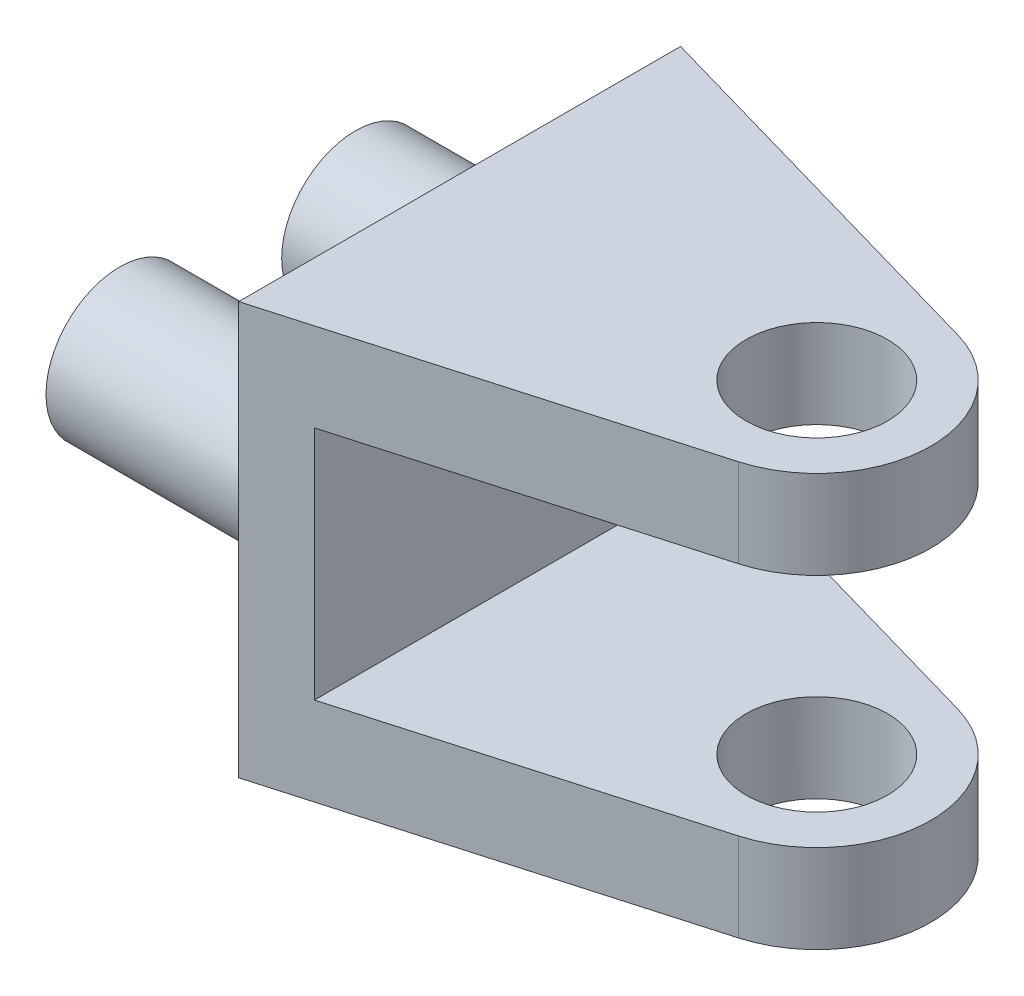
ISO-10303-21;
HEADER;
FILE_DESCRIPTION(('STEP AP214'),'2;1');
FILE_NAME('part.step','',(''),(''),'','','');
FILE_SCHEMA(('AUTOMOTIVE_DESIGN { 1 0 10303 214 1 1 1 1 }'));
ENDSEC;
DATA;
#1=APPLICATION_CONTEXT('core data for automotive mechanical design processes');
#2=APPLICATION_PROTOCOL_DEFINITION('international standard','automotive_design',2000,#1);
#3=PRODUCT_CONTEXT('',#1,'mechanical');
#4=PRODUCT('Part','Part','',(#3));
#5=PRODUCT_RELATED_PRODUCT_CATEGORY('part','',(#4));
#6=PRODUCT_DEFINITION_FORMATION('','',#4);
#7=PRODUCT_DEFINITION_CONTEXT('part definition',#1,'design');
#8=PRODUCT_DEFINITION('design','',#6,#7);
#9=PRODUCT_DEFINITION_SHAPE('','',#8);
#10=(LENGTH_UNIT() NAMED_UNIT(*) SI_UNIT(.MILLI.,.METRE.));
#11=(NAMED_UNIT(*) PLANE_ANGLE_UNIT() SI_UNIT($,.RADIAN.));
#12=(NAMED_UNIT(*) SI_UNIT($,.STERADIAN.) SOLID_ANGLE_UNIT());
#13=UNCERTAINTY_MEASURE_WITH_UNIT(LENGTH_MEASURE(1.E-05),#10,'distance_accuracy_value','');
#14=(GEOMETRIC_REPRESENTATION_CONTEXT(3) GLOBAL_UNCERTAINTY_ASSIGNED_CONTEXT((#13)) GLOBAL_UNIT_ASSIGNED_CONTEXT((#10,
#11,#12)) REPRESENTATION_CONTEXT('',''));
#15=CARTESIAN_POINT('',(0.,0.,0.));
#16=DIRECTION('',(0.,0.,1.));
#17=DIRECTION('',(1.,0.,0.));
#18=AXIS2_PLACEMENT_3D('',#15,#16,#17);
#19=CARTESIAN_POINT('',(0.,14.,0.));
#20=DIRECTION('',(0.,-1.,0.));
#21=DIRECTION('',(0.,0.,-1.));
#22=AXIS2_PLACEMENT_3D('',#19,#20,#21);
#23=CYLINDRICAL_SURFACE('',#22,3.875);
#24=DIRECTION('',(0.,-1.,0.));
#25=VECTOR('',#24,1.);
#26=CARTESIAN_POINT('',(1.06602054618055,14.,3.72548321632522));
#27=LINE('',#26,#25);
#28=CARTESIAN_POINT('',(1.06602054618055,14.,3.72548321632522));
#29=VERTEX_POINT('',#28);
#30=CARTESIAN_POINT('',(1.06602054618055,11.,3.72548321632522));
#31=VERTEX_POINT('',#30);
#32=EDGE_CURVE('E132',#29,#31,#27,.T.);
#33=ORIENTED_EDGE('',*,*,#32,.T.);
#34=CARTESIAN_POINT('',(0.,11.,0.));
#35=DIRECTION('',(0.,1.,0.));
#36=DIRECTION('',(0.,0.,1.));
#37=AXIS2_PLACEMENT_3D('',#34,#35,#36);
#38=CIRCLE('',#37,3.875);
#39=CARTESIAN_POINT('',(1.06602054618055,11.,-3.72548321632523));
#40=VERTEX_POINT('',#39);
#41=EDGE_CURVE('E176',#31,#40,#38,.T.);
#42=ORIENTED_EDGE('',*,*,#41,.T.);
#43=DIRECTION('',(0.,-1.,0.));
#44=VECTOR('',#43,1.);
#45=CARTESIAN_POINT('',(1.06602054618055,14.,-3.72548321632523));
#46=LINE('',#45,#44);
#47=CARTESIAN_POINT('',(1.06602054618055,14.,-3.72548321632523));
#48=VERTEX_POINT('',#47);
#49=EDGE_CURVE('E144',#48,#40,#46,.T.);
#50=ORIENTED_EDGE('',*,*,#49,.F.);
#51=CARTESIAN_POINT('',(0.,14.,0.));
#52=DIRECTION('',(0.,1.,0.));
#53=DIRECTION('',(0.,0.,1.));
#54=AXIS2_PLACEMENT_3D('',#51,#52,#53);
#55=CIRCLE('',#54,3.875);
#56=EDGE_CURVE('E88',#29,#48,#55,.T.);
#57=ORIENTED_EDGE('',*,*,#56,.F.);
#58=EDGE_LOOP('',(#33,#42,#50,#57));
#59=FACE_BOUND('',#58,.T.);
#60=ADVANCED_FACE('F35',(#59),#23,.T.);
#61=CARTESIAN_POINT('',(0.,14.,0.));
#62=DIRECTION('',(0.,-1.,0.));
#63=DIRECTION('',(0.,0.,-1.));
#64=AXIS2_PLACEMENT_3D('',#61,#62,#63);
#65=CYLINDRICAL_SURFACE('',#64,2.4);
#66=CARTESIAN_POINT('',(0.,11.,0.));
#67=DIRECTION('',(0.,1.,0.));
#68=DIRECTION('',(0.,0.,1.));
#69=AXIS2_PLACEMENT_3D('',#66,#67,#68);
#70=CIRCLE('',#69,2.4);
#71=CARTESIAN_POINT('',(0.,11.,2.4));
#72=VERTEX_POINT('',#71);
#73=EDGE_CURVE('E138',#72,#72,#70,.T.);
#74=ORIENTED_EDGE('',*,*,#73,.F.);
#75=EDGE_LOOP('',(#74));
#76=FACE_BOUND('',#75,.T.);
#77=CARTESIAN_POINT('',(0.,14.,0.));
#78=DIRECTION('',(0.,1.,0.));
#79=DIRECTION('',(0.,0.,1.));
#80=AXIS2_PLACEMENT_3D('',#77,#78,#79);
#81=CIRCLE('',#80,2.4);
#82=CARTESIAN_POINT('',(0.,14.,2.4));
#83=VERTEX_POINT('',#82);
#84=EDGE_CURVE('E161',#83,#83,#81,.T.);
#85=ORIENTED_EDGE('',*,*,#84,.T.);
#86=EDGE_LOOP('',(#85));
#87=FACE_BOUND('',#86,.T.);
#88=ADVANCED_FACE('F223',(#76,#87),#65,.F.);
#89=CARTESIAN_POINT('',(0.,14.,0.));
#90=DIRECTION('',(0.,1.,0.));
#91=DIRECTION('',(0.,0.,1.));
#92=AXIS2_PLACEMENT_3D('',#89,#90,#91);
#93=PLANE('',#92);
#94=DIRECTION('',(0.961415023567799,0.,-0.27510207643369));
#95=VECTOR('',#94,1.);
#96=CARTESIAN_POINT('',(-12.125,14.,7.5));
#97=LINE('',#96,#95);
#98=CARTESIAN_POINT('',(-12.125,14.,7.5));
#99=VERTEX_POINT('',#98);
#100=EDGE_CURVE('E152',#99,#29,#97,.T.);
#101=ORIENTED_EDGE('',*,*,#100,.T.);
#102=ORIENTED_EDGE('',*,*,#56,.T.);
#103=DIRECTION('',(-0.9614150235678,0.,-0.27510207643369));
#104=VECTOR('',#103,1.);
#105=CARTESIAN_POINT('',(-12.125,14.,-7.5));
#106=LINE('',#105,#104);
#107=CARTESIAN_POINT('',(-12.125,14.,-7.5));
#108=VERTEX_POINT('',#107);
#109=EDGE_CURVE('E163',#48,#108,#106,.T.);
#110=ORIENTED_EDGE('',*,*,#109,.T.);
#111=DIRECTION('',(0.,0.,1.));
#112=VECTOR('',#111,1.);
#113=CARTESIAN_POINT('',(-12.125,14.,-7.5));
#114=LINE('',#113,#112);
#115=EDGE_CURVE('E59',#108,#99,#114,.T.);
#116=ORIENTED_EDGE('',*,*,#115,.T.);
#117=EDGE_LOOP('',(#101,#102,#110,#116));
#118=FACE_BOUND('',#117,.T.);
#119=ORIENTED_EDGE('',*,*,#84,.F.);
#120=EDGE_LOOP('',(#119));
#121=FACE_BOUND('',#120,.T.);
#122=ADVANCED_FACE('F228',(#118,#121),#93,.T.);
#123=CARTESIAN_POINT('',(0.,0.,0.));
#124=DIRECTION('',(0.,1.,0.));
#125=DIRECTION('',(0.,0.,1.));
#126=AXIS2_PLACEMENT_3D('',#123,#124,#125);
#127=PLANE('',#126);
#128=DIRECTION('',(0.961415023567799,0.,-0.27510207643369));
#129=VECTOR('',#128,1.);
#130=CARTESIAN_POINT('',(-12.125,0.,7.5));
#131=LINE('',#130,#129);
#132=CARTESIAN_POINT('',(-12.125,0.,7.5));
#133=VERTEX_POINT('',#132);
#134=CARTESIAN_POINT('',(1.06602054618055,0.,3.72548321632522));
#135=VERTEX_POINT('',#134);
#136=EDGE_CURVE('E158',#133,#135,#131,.T.);
#137=ORIENTED_EDGE('',*,*,#136,.F.);
#138=DIRECTION('',(0.,0.,1.));
#139=VECTOR('',#138,1.);
#140=CARTESIAN_POINT('',(-12.125,0.,-7.5));
#141=LINE('',#140,#139);
#142=CARTESIAN_POINT('',(-12.125,0.,-7.5));
#143=VERTEX_POINT('',#142);
#144=EDGE_CURVE('E80',#143,#133,#141,.T.);
#145=ORIENTED_EDGE('',*,*,#144,.F.);
#146=DIRECTION('',(-0.9614150235678,0.,-0.27510207643369));
#147=VECTOR('',#146,1.);
#148=CARTESIAN_POINT('',(-12.125,0.,-7.5));
#149=LINE('',#148,#147);
#150=CARTESIAN_POINT('',(1.06602054618055,0.,-3.72548321632523));
#151=VERTEX_POINT('',#150);
#152=EDGE_CURVE('E153',#151,#143,#149,.T.);
#153=ORIENTED_EDGE('',*,*,#152,.F.);
#154=CARTESIAN_POINT('',(0.,0.,0.));
#155=DIRECTION('',(0.,1.,0.));
#156=DIRECTION('',(0.,0.,1.));
#157=AXIS2_PLACEMENT_3D('',#154,#155,#156);
#158=CIRCLE('',#157,3.875);
#159=EDGE_CURVE('E155',#135,#151,#158,.T.);
#160=ORIENTED_EDGE('',*,*,#159,.F.);
#161=EDGE_LOOP('',(#137,#145,#153,#160));
#162=FACE_BOUND('',#161,.T.);
#163=CARTESIAN_POINT('',(0.,0.,0.));
#164=DIRECTION('',(0.,1.,0.));
#165=DIRECTION('',(0.,0.,1.));
#166=AXIS2_PLACEMENT_3D('',#163,#164,#165);
#167=CIRCLE('',#166,2.4);
#168=CARTESIAN_POINT('',(0.,0.,2.4));
#169=VERTEX_POINT('',#168);
#170=EDGE_CURVE('E167',#169,#169,#167,.T.);
#171=ORIENTED_EDGE('',*,*,#170,.T.);
#172=EDGE_LOOP('',(#171));
#173=FACE_BOUND('',#172,.T.);
#174=ADVANCED_FACE('F239',(#162,#173),#127,.F.);
#175=CARTESIAN_POINT('',(-12.125,14.,7.5));
#176=DIRECTION('',(-0.27510207643369,0.,-0.961415023567799));
#177=DIRECTION('',(-0.961415023567799,0.,0.27510207643369));
#178=AXIS2_PLACEMENT_3D('',#175,#176,#177);
#179=PLANE('',#178);
#180=DIRECTION('',(0.,1.,0.));
#181=VECTOR('',#180,1.);
#182=CARTESIAN_POINT('',(-10.125,14.,6.92771421354996));
#183=LINE('',#182,#181);
#184=CARTESIAN_POINT('',(-10.125,3.,6.92771421354996));
#185=VERTEX_POINT('',#184);
#186=CARTESIAN_POINT('',(-10.125,11.,6.92771421354996));
#187=VERTEX_POINT('',#186);
#188=EDGE_CURVE('E124',#185,#187,#183,.T.);
#189=ORIENTED_EDGE('',*,*,#188,.T.);
#190=DIRECTION('',(0.961415023567799,0.,-0.27510207643369));
#191=VECTOR('',#190,1.);
#192=CARTESIAN_POINT('',(-12.125,11.,7.5));
#193=LINE('',#192,#191);
#194=EDGE_CURVE('E173',#187,#31,#193,.T.);
#195=ORIENTED_EDGE('',*,*,#194,.T.);
#196=ORIENTED_EDGE('',*,*,#32,.F.);
#197=ORIENTED_EDGE('',*,*,#100,.F.);
#198=DIRECTION('',(0.,-1.,0.));
#199=VECTOR('',#198,1.);
#200=CARTESIAN_POINT('',(-12.125,14.,7.5));
#201=LINE('',#200,#199);
#202=EDGE_CURVE('E149',#99,#133,#201,.T.);
#203=ORIENTED_EDGE('',*,*,#202,.T.);
#204=ORIENTED_EDGE('',*,*,#136,.T.);
#205=CARTESIAN_POINT('',(1.06602054618055,3.,3.72548321632522));
#206=VERTEX_POINT('',#205);
#207=EDGE_CURVE('E135',#206,#135,#27,.T.);
#208=ORIENTED_EDGE('',*,*,#207,.F.);
#209=DIRECTION('',(-0.961415023567799,0.,0.27510207643369));
#210=VECTOR('',#209,1.);
#211=CARTESIAN_POINT('',(-12.125,3.,7.5));
#212=LINE('',#211,#210);
#213=EDGE_CURVE('E141',#206,#185,#212,.T.);
#214=ORIENTED_EDGE('',*,*,#213,.T.);
#215=EDGE_LOOP('',(#189,#195,#196,#197,#203,#204,#208,#214));
#216=FACE_BOUND('',#215,.T.);
#217=ADVANCED_FACE('F37',(#216),#179,.F.);
#218=CARTESIAN_POINT('',(1.06602054618055,3.,-3.72548321632523));
#219=VERTEX_POINT('',#218);
#220=EDGE_CURVE('E146',#219,#151,#46,.T.);
#221=ORIENTED_EDGE('',*,*,#220,.F.);
#222=CARTESIAN_POINT('',(0.,3.,0.));
#223=DIRECTION('',(0.,-1.,0.));
#224=DIRECTION('',(0.,0.,-1.));
#225=AXIS2_PLACEMENT_3D('',#222,#223,#224);
#226=CIRCLE('',#225,3.875);
#227=EDGE_CURVE('E50',#219,#206,#226,.T.);
#228=ORIENTED_EDGE('',*,*,#227,.T.);
#229=ORIENTED_EDGE('',*,*,#207,.T.);
#230=ORIENTED_EDGE('',*,*,#159,.T.);
#231=EDGE_LOOP('',(#221,#228,#229,#230));
#232=FACE_BOUND('',#231,.T.);
#233=ADVANCED_FACE('F224',(#232),#23,.T.);
#234=CARTESIAN_POINT('',(-12.125,14.,-7.5));
#235=DIRECTION('',(-0.27510207643369,0.,0.961415023567799));
#236=DIRECTION('',(0.9614150235678,0.,0.27510207643369));
#237=AXIS2_PLACEMENT_3D('',#234,#235,#236);
#238=PLANE('',#237);
#239=ORIENTED_EDGE('',*,*,#49,.T.);
#240=DIRECTION('',(-0.9614150235678,0.,-0.27510207643369));
#241=VECTOR('',#240,1.);
#242=CARTESIAN_POINT('',(-12.125,11.,-7.5));
#243=LINE('',#242,#241);
#244=CARTESIAN_POINT('',(-10.125,11.,-6.92771421354996));
#245=VERTEX_POINT('',#244);
#246=EDGE_CURVE('E131',#40,#245,#243,.T.);
#247=ORIENTED_EDGE('',*,*,#246,.T.);
#248=DIRECTION('',(0.,-1.,0.));
#249=VECTOR('',#248,1.);
#250=CARTESIAN_POINT('',(-10.125,14.,-6.92771421354996));
#251=LINE('',#250,#249);
#252=CARTESIAN_POINT('',(-10.125,3.,-6.92771421354996));
#253=VERTEX_POINT('',#252);
#254=EDGE_CURVE('E121',#245,#253,#251,.T.);
#255=ORIENTED_EDGE('',*,*,#254,.T.);
#256=DIRECTION('',(0.9614150235678,0.,0.27510207643369));
#257=VECTOR('',#256,1.);
#258=CARTESIAN_POINT('',(-12.125,3.,-7.5));
#259=LINE('',#258,#257);
#260=EDGE_CURVE('E108',#253,#219,#259,.T.);
#261=ORIENTED_EDGE('',*,*,#260,.T.);
#262=ORIENTED_EDGE('',*,*,#220,.T.);
#263=ORIENTED_EDGE('',*,*,#152,.T.);
#264=DIRECTION('',(0.,-1.,0.));
#265=VECTOR('',#264,1.);
#266=CARTESIAN_POINT('',(-12.125,14.,-7.5));
#267=LINE('',#266,#265);
#268=EDGE_CURVE('E147',#108,#143,#267,.T.);
#269=ORIENTED_EDGE('',*,*,#268,.F.);
#270=ORIENTED_EDGE('',*,*,#109,.F.);
#271=EDGE_LOOP('',(#239,#247,#255,#261,#262,#263,#269,#270));
#272=FACE_BOUND('',#271,.T.);
#273=ADVANCED_FACE('F130',(#272),#238,.F.);
#274=CARTESIAN_POINT('',(-12.125,14.,-7.5));
#275=DIRECTION('',(1.,0.,0.));
#276=DIRECTION('',(0.,0.,-1.));
#277=AXIS2_PLACEMENT_3D('',#274,#275,#276);
#278=PLANE('',#277);
#279=CARTESIAN_POINT('',(-12.125,7.,-3.99999999999999));
#280=DIRECTION('',(1.,0.,0.));
#281=DIRECTION('',(0.,0.,-1.));
#282=AXIS2_PLACEMENT_3D('',#279,#280,#281);
#283=CIRCLE('',#282,2.5);
#284=CARTESIAN_POINT('',(-12.125,7.,-6.5));
#285=VERTEX_POINT('',#284);
#286=EDGE_CURVE('E11',#285,#285,#283,.F.);
#287=ORIENTED_EDGE('',*,*,#286,.F.);
#288=EDGE_LOOP('',(#287));
#289=FACE_BOUND('',#288,.T.);
#290=CARTESIAN_POINT('',(-12.125,7.,4.00000000000001));
#291=DIRECTION('',(1.,0.,0.));
#292=DIRECTION('',(0.,0.,-1.));
#293=AXIS2_PLACEMENT_3D('',#290,#291,#292);
#294=CIRCLE('',#293,2.5);
#295=CARTESIAN_POINT('',(-12.125,7.,1.50000000000001));
#296=VERTEX_POINT('',#295);
#297=EDGE_CURVE('E43',#296,#296,#294,.F.);
#298=ORIENTED_EDGE('',*,*,#297,.F.);
#299=EDGE_LOOP('',(#298));
#300=FACE_BOUND('',#299,.T.);
#301=ORIENTED_EDGE('',*,*,#144,.T.);
#302=ORIENTED_EDGE('',*,*,#202,.F.);
#303=ORIENTED_EDGE('',*,*,#115,.F.);
#304=ORIENTED_EDGE('',*,*,#268,.T.);
#305=EDGE_LOOP('',(#301,#302,#303,#304));
#306=FACE_BOUND('',#305,.T.);
#307=ADVANCED_FACE('F219',(#289,#300,#306),#278,.F.);
#308=CARTESIAN_POINT('',(0.,3.,0.));
#309=DIRECTION('',(0.,-1.,0.));
#310=DIRECTION('',(0.,0.,-1.));
#311=AXIS2_PLACEMENT_3D('',#308,#309,#310);
#312=CIRCLE('',#311,2.4);
#313=CARTESIAN_POINT('',(0.,3.,-2.4));
#314=VERTEX_POINT('',#313);
#315=EDGE_CURVE('E116',#314,#314,#312,.T.);
#316=ORIENTED_EDGE('',*,*,#315,.F.);
#317=EDGE_LOOP('',(#316));
#318=FACE_BOUND('',#317,.T.);
#319=ORIENTED_EDGE('',*,*,#170,.F.);
#320=EDGE_LOOP('',(#319));
#321=FACE_BOUND('',#320,.T.);
#322=ADVANCED_FACE('F231',(#318,#321),#65,.F.);
#323=CARTESIAN_POINT('',(-10.125,11.,-26.));
#324=DIRECTION('',(-1.,0.,0.));
#325=DIRECTION('',(0.,-1.,0.));
#326=AXIS2_PLACEMENT_3D('',#323,#324,#325);
#327=PLANE('',#326);
#328=DIRECTION('',(0.,0.,1.));
#329=VECTOR('',#328,1.);
#330=CARTESIAN_POINT('',(-10.125,3.,-26.));
#331=LINE('',#330,#329);
#332=EDGE_CURVE('E111',#253,#185,#331,.T.);
#333=ORIENTED_EDGE('',*,*,#332,.F.);
#334=ORIENTED_EDGE('',*,*,#254,.F.);
#335=DIRECTION('',(0.,0.,1.));
#336=VECTOR('',#335,1.);
#337=CARTESIAN_POINT('',(-10.125,11.,-26.));
#338=LINE('',#337,#336);
#339=EDGE_CURVE('E125',#245,#187,#338,.T.);
#340=ORIENTED_EDGE('',*,*,#339,.T.);
#341=ORIENTED_EDGE('',*,*,#188,.F.);
#342=EDGE_LOOP('',(#333,#334,#340,#341));
#343=FACE_BOUND('',#342,.T.);
#344=ADVANCED_FACE('F119',(#343),#327,.F.);
#345=CARTESIAN_POINT('',(-10.125,11.,-26.));
#346=DIRECTION('',(0.,1.,0.));
#347=DIRECTION('',(0.,0.,1.));
#348=AXIS2_PLACEMENT_3D('',#345,#346,#347);
#349=PLANE('',#348);
#350=ORIENTED_EDGE('',*,*,#73,.T.);
#351=EDGE_LOOP('',(#350));
#352=FACE_BOUND('',#351,.T.);
#353=ORIENTED_EDGE('',*,*,#339,.F.);
#354=ORIENTED_EDGE('',*,*,#246,.F.);
#355=ORIENTED_EDGE('',*,*,#41,.F.);
#356=ORIENTED_EDGE('',*,*,#194,.F.);
#357=EDGE_LOOP('',(#353,#354,#355,#356));
#358=FACE_BOUND('',#357,.T.);
#359=ADVANCED_FACE('F253',(#352,#358),#349,.F.);
#360=CARTESIAN_POINT('',(-10.125,3.,-26.));
#361=DIRECTION('',(0.,-1.,0.));
#362=DIRECTION('',(0.,0.,-1.));
#363=AXIS2_PLACEMENT_3D('',#360,#361,#362);
#364=PLANE('',#363);
#365=ORIENTED_EDGE('',*,*,#315,.T.);
#366=EDGE_LOOP('',(#365));
#367=FACE_BOUND('',#366,.T.);
#368=ORIENTED_EDGE('',*,*,#227,.F.);
#369=ORIENTED_EDGE('',*,*,#260,.F.);
#370=ORIENTED_EDGE('',*,*,#332,.T.);
#371=ORIENTED_EDGE('',*,*,#213,.F.);
#372=EDGE_LOOP('',(#368,#369,#370,#371));
#373=FACE_BOUND('',#372,.T.);
#374=ADVANCED_FACE('F110',(#367,#373),#364,.F.);
#375=CARTESIAN_POINT('',(-19.665,7.,4.00000000000001));
#376=DIRECTION('',(-1.,0.,0.));
#377=DIRECTION('',(0.,0.,1.));
#378=AXIS2_PLACEMENT_3D('',#375,#376,#377);
#379=PLANE('',#378);
#380=CARTESIAN_POINT('',(-19.665,7.,4.00000000000001));
#381=DIRECTION('',(-1.,0.,0.));
#382=DIRECTION('',(0.,0.,1.));
#383=AXIS2_PLACEMENT_3D('',#380,#381,#382);
#384=CIRCLE('',#383,2.5);
#385=CARTESIAN_POINT('',(-19.665,7.,6.50000000000001));
#386=VERTEX_POINT('',#385);
#387=EDGE_CURVE('E126',#386,#386,#384,.T.);
#388=ORIENTED_EDGE('',*,*,#387,.T.);
#389=EDGE_LOOP('',(#388));
#390=FACE_BOUND('',#389,.T.);
#391=CARTESIAN_POINT('',(-19.665,7.,4.00000000000001));
#392=DIRECTION('',(-1.,0.,0.));
#393=DIRECTION('',(0.,0.,1.));
#394=AXIS2_PLACEMENT_3D('',#391,#392,#393);
#395=CIRCLE('',#394,1.5);
#396=CARTESIAN_POINT('',(-19.665,7.,5.50000000000001));
#397=VERTEX_POINT('',#396);
#398=EDGE_CURVE('E185',#397,#397,#395,.T.);
#399=ORIENTED_EDGE('',*,*,#398,.F.);
#400=EDGE_LOOP('',(#399));
#401=FACE_BOUND('',#400,.T.);
#402=ADVANCED_FACE('F261',(#390,#401),#379,.T.);
#403=CARTESIAN_POINT('',(-19.665,7.,4.00000000000001));
#404=DIRECTION('',(1.,0.,0.));
#405=DIRECTION('',(0.,0.,-1.));
#406=AXIS2_PLACEMENT_3D('',#403,#404,#405);
#407=CYLINDRICAL_SURFACE('',#406,2.5);
#408=ORIENTED_EDGE('',*,*,#387,.F.);
#409=EDGE_LOOP('',(#408));
#410=FACE_BOUND('',#409,.T.);
#411=ORIENTED_EDGE('',*,*,#297,.T.);
#412=EDGE_LOOP('',(#411));
#413=FACE_BOUND('',#412,.T.);
#414=ADVANCED_FACE('F266',(#410,#413),#407,.T.);
#415=CARTESIAN_POINT('',(-19.665,7.,4.00000000000001));
#416=DIRECTION('',(1.,0.,0.));
#417=DIRECTION('',(0.,0.,-1.));
#418=AXIS2_PLACEMENT_3D('',#415,#416,#417);
#419=CYLINDRICAL_SURFACE('',#418,1.5);
#420=ORIENTED_EDGE('',*,*,#398,.T.);
#421=EDGE_LOOP('',(#420));
#422=FACE_BOUND('',#421,.T.);
#423=CARTESIAN_POINT('',(-12.125,7.,4.00000000000001));
#424=DIRECTION('',(-1.,0.,0.));
#425=DIRECTION('',(0.,0.,1.));
#426=AXIS2_PLACEMENT_3D('',#423,#424,#425);
#427=CIRCLE('',#426,1.5);
#428=CARTESIAN_POINT('',(-12.125,7.,5.50000000000001));
#429=VERTEX_POINT('',#428);
#430=EDGE_CURVE('E186',#429,#429,#427,.T.);
#431=ORIENTED_EDGE('',*,*,#430,.F.);
#432=EDGE_LOOP('',(#431));
#433=FACE_BOUND('',#432,.T.);
#434=ADVANCED_FACE('F216',(#422,#433),#419,.F.);
#435=ORIENTED_EDGE('',*,*,#430,.T.);
#436=EDGE_LOOP('',(#435));
#437=FACE_BOUND('',#436,.T.);
#438=ADVANCED_FACE('F207',(#437),#278,.F.);
#439=CARTESIAN_POINT('',(-19.665,7.,-3.99999999999999));
#440=DIRECTION('',(-1.,0.,0.));
#441=DIRECTION('',(0.,0.,1.));
#442=AXIS2_PLACEMENT_3D('',#439,#440,#441);
#443=PLANE('',#442);
#444=CARTESIAN_POINT('',(-19.665,7.,-3.99999999999999));
#445=DIRECTION('',(-1.,0.,0.));
#446=DIRECTION('',(0.,0.,1.));
#447=AXIS2_PLACEMENT_3D('',#444,#445,#446);
#448=CIRCLE('',#447,2.5);
#449=CARTESIAN_POINT('',(-19.665,7.,-1.49999999999999));
#450=VERTEX_POINT('',#449);
#451=EDGE_CURVE('E189',#450,#450,#448,.T.);
#452=ORIENTED_EDGE('',*,*,#451,.T.);
#453=EDGE_LOOP('',(#452));
#454=FACE_BOUND('',#453,.T.);
#455=CARTESIAN_POINT('',(-19.665,7.,-3.99999999999999));
#456=DIRECTION('',(-1.,0.,0.));
#457=DIRECTION('',(0.,0.,1.));
#458=AXIS2_PLACEMENT_3D('',#455,#456,#457);
#459=CIRCLE('',#458,1.5);
#460=CARTESIAN_POINT('',(-19.665,7.,-2.49999999999999));
#461=VERTEX_POINT('',#460);
#462=EDGE_CURVE('E194',#461,#461,#459,.T.);
#463=ORIENTED_EDGE('',*,*,#462,.F.);
#464=EDGE_LOOP('',(#463));
#465=FACE_BOUND('',#464,.T.);
#466=ADVANCED_FACE('F204',(#454,#465),#443,.T.);
#467=CARTESIAN_POINT('',(-19.665,7.,-3.99999999999999));
#468=DIRECTION('',(1.,0.,0.));
#469=DIRECTION('',(0.,0.,-1.));
#470=AXIS2_PLACEMENT_3D('',#467,#468,#469);
#471=CYLINDRICAL_SURFACE('',#470,2.5);
#472=ORIENTED_EDGE('',*,*,#451,.F.);
#473=EDGE_LOOP('',(#472));
#474=FACE_BOUND('',#473,.T.);
#475=ORIENTED_EDGE('',*,*,#286,.T.);
#476=EDGE_LOOP('',(#475));
#477=FACE_BOUND('',#476,.T.);
#478=ADVANCED_FACE('F206',(#474,#477),#471,.T.);
#479=CARTESIAN_POINT('',(-19.665,7.,-3.99999999999999));
#480=DIRECTION('',(1.,0.,0.));
#481=DIRECTION('',(0.,0.,-1.));
#482=AXIS2_PLACEMENT_3D('',#479,#480,#481);
#483=CYLINDRICAL_SURFACE('',#482,1.5);
#484=ORIENTED_EDGE('',*,*,#462,.T.);
#485=EDGE_LOOP('',(#484));
#486=FACE_BOUND('',#485,.T.);
#487=CARTESIAN_POINT('',(-12.125,7.,-3.99999999999999));
#488=DIRECTION('',(-1.,0.,0.));
#489=DIRECTION('',(0.,0.,1.));
#490=AXIS2_PLACEMENT_3D('',#487,#488,#489);
#491=CIRCLE('',#490,1.5);
#492=CARTESIAN_POINT('',(-12.125,7.,-2.49999999999999));
#493=VERTEX_POINT('',#492);
#494=EDGE_CURVE('E195',#493,#493,#491,.T.);
#495=ORIENTED_EDGE('',*,*,#494,.F.);
#496=EDGE_LOOP('',(#495));
#497=FACE_BOUND('',#496,.T.);
#498=ADVANCED_FACE('F201',(#486,#497),#483,.F.);
#499=ORIENTED_EDGE('',*,*,#494,.T.);
#500=EDGE_LOOP('',(#499));
#501=FACE_BOUND('',#500,.T.);
#502=ADVANCED_FACE('F220',(#501),#278,.F.);
#503=CLOSED_SHELL('',(#60,#88,#122,#174,#217,#233,#273,#307,#322,#344,#359,#374,#402,#414,#434,
#438,#466,#478,#498,#502));
#504=MANIFOLD_SOLID_BREP('B2',#503);
#505=ADVANCED_BREP_SHAPE_REPRESENTATION('',(#18,#504),#14);
#506=SHAPE_DEFINITION_REPRESENTATION(#9,#505);
ENDSEC;
END-ISO-10303-21;
